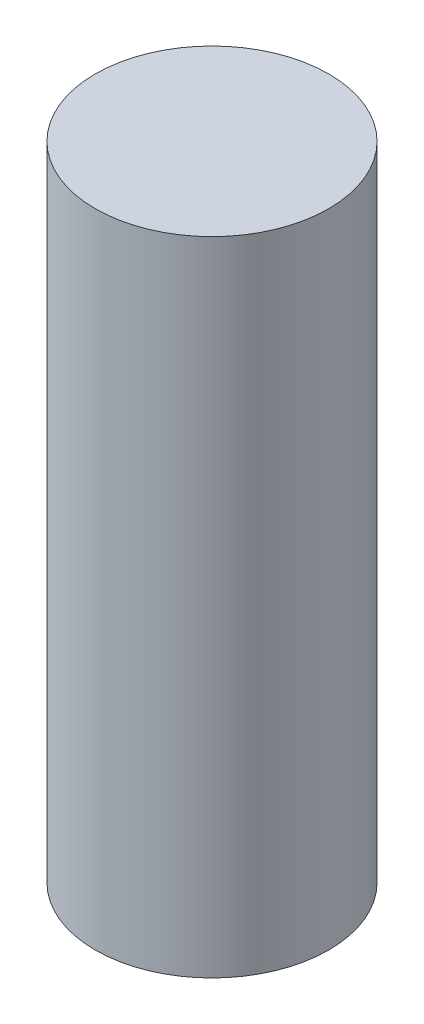
ISO-10303-21;
HEADER;
FILE_DESCRIPTION(('STEP AP214'),'2;1');
FILE_NAME('part.step','',(''),(''),'','','');
FILE_SCHEMA(('AUTOMOTIVE_DESIGN { 1 0 10303 214 1 1 1 1 }'));
ENDSEC;
DATA;
#1=APPLICATION_CONTEXT('core data for automotive mechanical design processes');
#2=APPLICATION_PROTOCOL_DEFINITION('international standard','automotive_design',2000,#1);
#3=PRODUCT_CONTEXT('',#1,'mechanical');
#4=PRODUCT('Part','Part','',(#3));
#5=PRODUCT_RELATED_PRODUCT_CATEGORY('part','',(#4));
#6=PRODUCT_DEFINITION_FORMATION('','',#4);
#7=PRODUCT_DEFINITION_CONTEXT('part definition',#1,'design');
#8=PRODUCT_DEFINITION('design','',#6,#7);
#9=PRODUCT_DEFINITION_SHAPE('','',#8);
#10=(LENGTH_UNIT() NAMED_UNIT(*) SI_UNIT(.MILLI.,.METRE.));
#11=(NAMED_UNIT(*) PLANE_ANGLE_UNIT() SI_UNIT($,.RADIAN.));
#12=(NAMED_UNIT(*) SI_UNIT($,.STERADIAN.) SOLID_ANGLE_UNIT());
#13=UNCERTAINTY_MEASURE_WITH_UNIT(LENGTH_MEASURE(1.E-05),#10,'distance_accuracy_value','');
#14=(GEOMETRIC_REPRESENTATION_CONTEXT(3) GLOBAL_UNCERTAINTY_ASSIGNED_CONTEXT((#13)) GLOBAL_UNIT_ASSIGNED_CONTEXT((#10,
#11,#12)) REPRESENTATION_CONTEXT('',''));
#15=CARTESIAN_POINT('',(0.,0.,0.));
#16=DIRECTION('',(0.,0.,1.));
#17=DIRECTION('',(1.,0.,0.));
#18=AXIS2_PLACEMENT_3D('',#15,#16,#17);
#19=CARTESIAN_POINT('',(0.,165.,0.));
#20=DIRECTION('',(0.,-1.,0.));
#21=DIRECTION('',(0.,0.,-1.));
#22=AXIS2_PLACEMENT_3D('',#19,#20,#21);
#23=CYLINDRICAL_SURFACE('',#22,30.);
#24=CARTESIAN_POINT('',(0.,165.,0.));
#25=DIRECTION('',(0.,1.,0.));
#26=DIRECTION('',(0.,0.,1.));
#27=AXIS2_PLACEMENT_3D('',#24,#25,#26);
#28=CIRCLE('',#27,30.);
#29=CARTESIAN_POINT('',(0.,165.,30.));
#30=VERTEX_POINT('',#29);
#31=EDGE_CURVE('E10',#30,#30,#28,.T.);
#32=ORIENTED_EDGE('',*,*,#31,.F.);
#33=EDGE_LOOP('',(#32));
#34=FACE_BOUND('',#33,.T.);
#35=CARTESIAN_POINT('',(0.,0.,0.));
#36=DIRECTION('',(0.,1.,0.));
#37=DIRECTION('',(0.,0.,1.));
#38=AXIS2_PLACEMENT_3D('',#35,#36,#37);
#39=CIRCLE('',#38,30.);
#40=CARTESIAN_POINT('',(0.,0.,30.));
#41=VERTEX_POINT('',#40);
#42=EDGE_CURVE('E38',#41,#41,#39,.T.);
#43=ORIENTED_EDGE('',*,*,#42,.T.);
#44=EDGE_LOOP('',(#43));
#45=FACE_BOUND('',#44,.T.);
#46=ADVANCED_FACE('F35',(#34,#45),#23,.T.);
#47=CARTESIAN_POINT('',(0.,165.,0.));
#48=DIRECTION('',(0.,1.,0.));
#49=DIRECTION('',(0.,0.,1.));
#50=AXIS2_PLACEMENT_3D('',#47,#48,#49);
#51=PLANE('',#50);
#52=ORIENTED_EDGE('',*,*,#31,.T.);
#53=EDGE_LOOP('',(#52));
#54=FACE_BOUND('',#53,.T.);
#55=ADVANCED_FACE('F50',(#54),#51,.T.);
#56=CARTESIAN_POINT('',(0.,0.,0.));
#57=DIRECTION('',(0.,1.,0.));
#58=DIRECTION('',(0.,0.,1.));
#59=AXIS2_PLACEMENT_3D('',#56,#57,#58);
#60=PLANE('',#59);
#61=ORIENTED_EDGE('',*,*,#42,.F.);
#62=EDGE_LOOP('',(#61));
#63=FACE_BOUND('',#62,.T.);
#64=ADVANCED_FACE('F48',(#63),#60,.F.);
#65=CLOSED_SHELL('',(#46,#55,#64));
#66=MANIFOLD_SOLID_BREP('B2',#65);
#67=ADVANCED_BREP_SHAPE_REPRESENTATION('',(#18,#66),#14);
#68=SHAPE_DEFINITION_REPRESENTATION(#9,#67);
ENDSEC;
END-ISO-10303-21;
